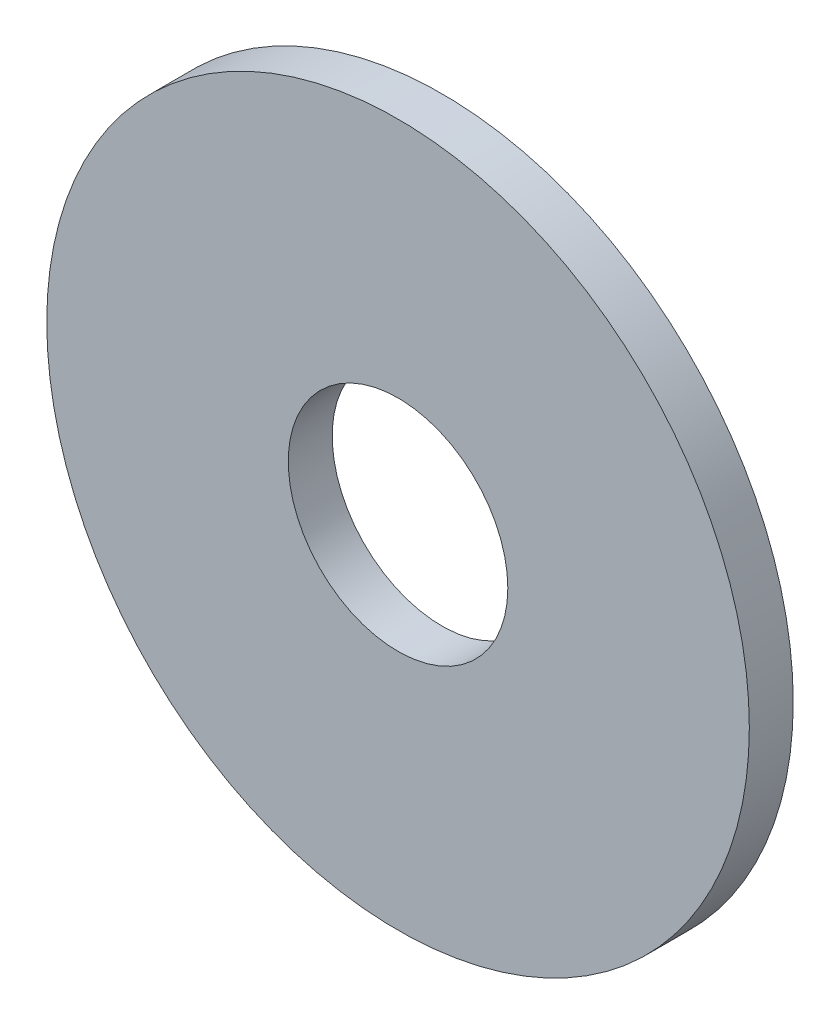
ISO-10303-21;
HEADER;
FILE_DESCRIPTION(('STEP AP214'),'2;1');
FILE_NAME('part.step','',(''),(''),'','','');
FILE_SCHEMA(('AUTOMOTIVE_DESIGN { 1 0 10303 214 1 1 1 1 }'));
ENDSEC;
DATA;
#1=APPLICATION_CONTEXT('core data for automotive mechanical design processes');
#2=APPLICATION_PROTOCOL_DEFINITION('international standard','automotive_design',2000,#1);
#3=PRODUCT_CONTEXT('',#1,'mechanical');
#4=PRODUCT('Part','Part','',(#3));
#5=PRODUCT_RELATED_PRODUCT_CATEGORY('part','',(#4));
#6=PRODUCT_DEFINITION_FORMATION('','',#4);
#7=PRODUCT_DEFINITION_CONTEXT('part definition',#1,'design');
#8=PRODUCT_DEFINITION('design','',#6,#7);
#9=PRODUCT_DEFINITION_SHAPE('','',#8);
#10=(LENGTH_UNIT() NAMED_UNIT(*) SI_UNIT(.MILLI.,.METRE.));
#11=(NAMED_UNIT(*) PLANE_ANGLE_UNIT() SI_UNIT($,.RADIAN.));
#12=(NAMED_UNIT(*) SI_UNIT($,.STERADIAN.) SOLID_ANGLE_UNIT());
#13=UNCERTAINTY_MEASURE_WITH_UNIT(LENGTH_MEASURE(1.E-05),#10,'distance_accuracy_value','');
#14=(GEOMETRIC_REPRESENTATION_CONTEXT(3) GLOBAL_UNCERTAINTY_ASSIGNED_CONTEXT((#13)) GLOBAL_UNIT_ASSIGNED_CONTEXT((#10,
#11,#12)) REPRESENTATION_CONTEXT('',''));
#15=CARTESIAN_POINT('',(0.,0.,0.));
#16=DIRECTION('',(0.,0.,1.));
#17=DIRECTION('',(1.,0.,0.));
#18=AXIS2_PLACEMENT_3D('',#15,#16,#17);
#19=CARTESIAN_POINT('',(0.,0.,2.));
#20=DIRECTION('',(0.,0.,1.));
#21=DIRECTION('',(1.,0.,0.));
#22=AXIS2_PLACEMENT_3D('',#19,#20,#21);
#23=PLANE('',#22);
#24=CARTESIAN_POINT('',(0.,0.,2.));
#25=DIRECTION('',(0.,0.,1.));
#26=DIRECTION('',(1.,0.,0.));
#27=AXIS2_PLACEMENT_3D('',#24,#25,#26);
#28=CIRCLE('',#27,16.);
#29=CARTESIAN_POINT('',(16.,0.,2.));
#30=VERTEX_POINT('',#29);
#31=EDGE_CURVE('E10',#30,#30,#28,.T.);
#32=ORIENTED_EDGE('',*,*,#31,.T.);
#33=EDGE_LOOP('',(#32));
#34=FACE_BOUND('',#33,.T.);
#35=CARTESIAN_POINT('',(0.,0.,2.));
#36=DIRECTION('',(0.,0.,1.));
#37=DIRECTION('',(1.,0.,0.));
#38=AXIS2_PLACEMENT_3D('',#35,#36,#37);
#39=CIRCLE('',#38,5.);
#40=CARTESIAN_POINT('',(5.,0.,2.));
#41=VERTEX_POINT('',#40);
#42=EDGE_CURVE('E50',#41,#41,#39,.T.);
#43=ORIENTED_EDGE('',*,*,#42,.F.);
#44=EDGE_LOOP('',(#43));
#45=FACE_BOUND('',#44,.T.);
#46=ADVANCED_FACE('F37',(#34,#45),#23,.T.);
#47=CARTESIAN_POINT('',(0.,0.,0.));
#48=DIRECTION('',(0.,0.,1.));
#49=DIRECTION('',(1.,0.,0.));
#50=AXIS2_PLACEMENT_3D('',#47,#48,#49);
#51=PLANE('',#50);
#52=CARTESIAN_POINT('',(0.,0.,0.));
#53=DIRECTION('',(0.,0.,1.));
#54=DIRECTION('',(1.,0.,0.));
#55=AXIS2_PLACEMENT_3D('',#52,#53,#54);
#56=CIRCLE('',#55,16.);
#57=CARTESIAN_POINT('',(16.,0.,0.));
#58=VERTEX_POINT('',#57);
#59=EDGE_CURVE('E41',#58,#58,#56,.T.);
#60=ORIENTED_EDGE('',*,*,#59,.F.);
#61=EDGE_LOOP('',(#60));
#62=FACE_BOUND('',#61,.T.);
#63=CARTESIAN_POINT('',(0.,0.,0.));
#64=DIRECTION('',(0.,0.,1.));
#65=DIRECTION('',(1.,0.,0.));
#66=AXIS2_PLACEMENT_3D('',#63,#64,#65);
#67=CIRCLE('',#66,5.);
#68=CARTESIAN_POINT('',(5.,0.,0.));
#69=VERTEX_POINT('',#68);
#70=EDGE_CURVE('E52',#69,#69,#67,.T.);
#71=ORIENTED_EDGE('',*,*,#70,.T.);
#72=EDGE_LOOP('',(#71));
#73=FACE_BOUND('',#72,.T.);
#74=ADVANCED_FACE('F64',(#62,#73),#51,.F.);
#75=CARTESIAN_POINT('',(0.,0.,2.));
#76=DIRECTION('',(0.,0.,-1.));
#77=DIRECTION('',(-1.,0.,0.));
#78=AXIS2_PLACEMENT_3D('',#75,#76,#77);
#79=CYLINDRICAL_SURFACE('',#78,16.);
#80=ORIENTED_EDGE('',*,*,#31,.F.);
#81=EDGE_LOOP('',(#80));
#82=FACE_BOUND('',#81,.T.);
#83=ORIENTED_EDGE('',*,*,#59,.T.);
#84=EDGE_LOOP('',(#83));
#85=FACE_BOUND('',#84,.T.);
#86=ADVANCED_FACE('F39',(#82,#85),#79,.T.);
#87=CARTESIAN_POINT('',(0.,0.,2.));
#88=DIRECTION('',(0.,0.,-1.));
#89=DIRECTION('',(-1.,0.,0.));
#90=AXIS2_PLACEMENT_3D('',#87,#88,#89);
#91=CYLINDRICAL_SURFACE('',#90,5.);
#92=ORIENTED_EDGE('',*,*,#42,.T.);
#93=EDGE_LOOP('',(#92));
#94=FACE_BOUND('',#93,.T.);
#95=ORIENTED_EDGE('',*,*,#70,.F.);
#96=EDGE_LOOP('',(#95));
#97=FACE_BOUND('',#96,.T.);
#98=ADVANCED_FACE('F60',(#94,#97),#91,.F.);
#99=CLOSED_SHELL('',(#46,#74,#86,#98));
#100=MANIFOLD_SOLID_BREP('B2',#99);
#101=ADVANCED_BREP_SHAPE_REPRESENTATION('',(#18,#100),#14);
#102=SHAPE_DEFINITION_REPRESENTATION(#9,#101);
ENDSEC;
END-ISO-10303-21;
